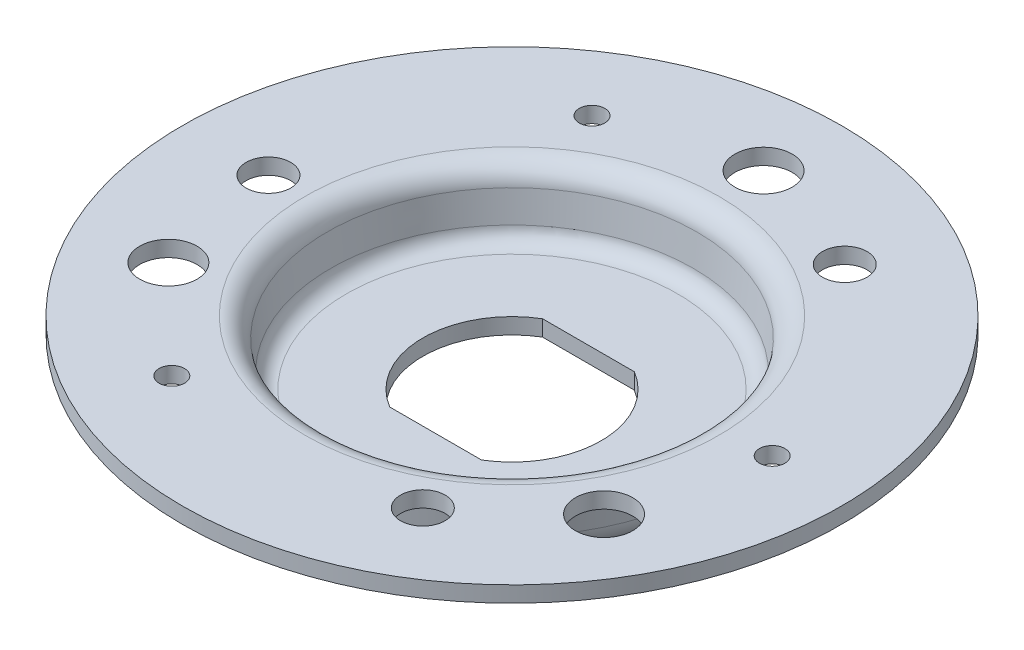
ISO-10303-21;
HEADER;
FILE_DESCRIPTION(('STEP AP214'),'2;1');
FILE_NAME('part.step','',(''),(''),'','','');
FILE_SCHEMA(('AUTOMOTIVE_DESIGN { 1 0 10303 214 1 1 1 1 }'));
ENDSEC;
DATA;
#1=APPLICATION_CONTEXT('core data for automotive mechanical design processes');
#2=APPLICATION_PROTOCOL_DEFINITION('international standard','automotive_design',2000,#1);
#3=PRODUCT_CONTEXT('',#1,'mechanical');
#4=PRODUCT('Part','Part','',(#3));
#5=PRODUCT_RELATED_PRODUCT_CATEGORY('part','',(#4));
#6=PRODUCT_DEFINITION_FORMATION('','',#4);
#7=PRODUCT_DEFINITION_CONTEXT('part definition',#1,'design');
#8=PRODUCT_DEFINITION('design','',#6,#7);
#9=PRODUCT_DEFINITION_SHAPE('','',#8);
#10=(LENGTH_UNIT() NAMED_UNIT(*) SI_UNIT(.MILLI.,.METRE.));
#11=(NAMED_UNIT(*) PLANE_ANGLE_UNIT() SI_UNIT($,.RADIAN.));
#12=(NAMED_UNIT(*) SI_UNIT($,.STERADIAN.) SOLID_ANGLE_UNIT());
#13=UNCERTAINTY_MEASURE_WITH_UNIT(LENGTH_MEASURE(1.E-05),#10,'distance_accuracy_value','');
#14=(GEOMETRIC_REPRESENTATION_CONTEXT(3) GLOBAL_UNCERTAINTY_ASSIGNED_CONTEXT((#13)) GLOBAL_UNIT_ASSIGNED_CONTEXT((#10,
#11,#12)) REPRESENTATION_CONTEXT('',''));
#15=CARTESIAN_POINT('',(0.,0.,0.));
#16=DIRECTION('',(0.,0.,1.));
#17=DIRECTION('',(1.,0.,0.));
#18=AXIS2_PLACEMENT_3D('',#15,#16,#17);
#19=CARTESIAN_POINT('',(0.,0.,12.));
#20=DIRECTION('',(0.,-1.,0.));
#21=DIRECTION('',(0.,0.,-1.));
#22=AXIS2_PLACEMENT_3D('',#19,#20,#21);
#23=PLANE('',#22);
#24=CARTESIAN_POINT('',(0.,0.,0.));
#25=DIRECTION('',(0.,1.,0.));
#26=DIRECTION('',(0.,0.,1.));
#27=AXIS2_PLACEMENT_3D('',#24,#25,#26);
#28=CIRCLE('',#27,14.);
#29=CARTESIAN_POINT('',(-7.21110255092797,0.,-12.));
#30=VERTEX_POINT('',#29);
#31=CARTESIAN_POINT('',(-7.21110255092797,0.,12.));
#32=VERTEX_POINT('',#31);
#33=EDGE_CURVE('E84',#30,#32,#28,.T.);
#34=ORIENTED_EDGE('',*,*,#33,.T.);
#35=DIRECTION('',(1.,0.,0.));
#36=VECTOR('',#35,1.);
#37=CARTESIAN_POINT('',(-7.21110255092797,0.,12.));
#38=LINE('',#37,#36);
#39=CARTESIAN_POINT('',(7.21110255092797,0.,12.));
#40=VERTEX_POINT('',#39);
#41=EDGE_CURVE('E91',#32,#40,#38,.T.);
#42=ORIENTED_EDGE('',*,*,#41,.T.);
#43=CARTESIAN_POINT('',(0.,0.,0.));
#44=DIRECTION('',(0.,1.,0.));
#45=DIRECTION('',(0.,0.,1.));
#46=AXIS2_PLACEMENT_3D('',#43,#44,#45);
#47=CIRCLE('',#46,14.);
#48=CARTESIAN_POINT('',(7.21110255092797,0.,-12.));
#49=VERTEX_POINT('',#48);
#50=EDGE_CURVE('E96',#40,#49,#47,.T.);
#51=ORIENTED_EDGE('',*,*,#50,.T.);
#52=DIRECTION('',(-1.,0.,0.));
#53=VECTOR('',#52,1.);
#54=CARTESIAN_POINT('',(-7.21110255092797,0.,-12.));
#55=LINE('',#54,#53);
#56=EDGE_CURVE('E88',#49,#30,#55,.T.);
#57=ORIENTED_EDGE('',*,*,#56,.T.);
#58=EDGE_LOOP('',(#34,#42,#51,#57));
#59=FACE_BOUND('',#58,.T.);
#60=CARTESIAN_POINT('',(0.,0.,0.));
#61=DIRECTION('',(0.,1.,0.));
#62=DIRECTION('',(0.,0.,1.));
#63=AXIS2_PLACEMENT_3D('',#60,#61,#62);
#64=CIRCLE('',#63,26.);
#65=CARTESIAN_POINT('',(0.,0.,26.));
#66=VERTEX_POINT('',#65);
#67=EDGE_CURVE('E170',#66,#66,#64,.T.);
#68=ORIENTED_EDGE('',*,*,#67,.F.);
#69=EDGE_LOOP('',(#68));
#70=FACE_BOUND('',#69,.T.);
#71=ADVANCED_FACE('F39',(#59,#70),#23,.T.);
#72=CARTESIAN_POINT('',(0.,5.,0.));
#73=DIRECTION('',(0.,1.,0.));
#74=DIRECTION('',(0.,0.,1.));
#75=AXIS2_PLACEMENT_3D('',#72,#73,#74);
#76=TOROIDAL_SURFACE('',#75,26.,5.);
#77=ORIENTED_EDGE('',*,*,#67,.T.);
#78=EDGE_LOOP('',(#77));
#79=FACE_BOUND('',#78,.T.);
#80=CARTESIAN_POINT('',(0.,4.42828852539193,0.));
#81=DIRECTION('',(0.,1.,0.));
#82=DIRECTION('',(0.,0.,1.));
#83=AXIS2_PLACEMENT_3D('',#80,#81,#82);
#84=CIRCLE('',#83,30.9672070612973);
#85=CARTESIAN_POINT('',(0.,4.42828852539193,30.9672070612973));
#86=VERTEX_POINT('',#85);
#87=EDGE_CURVE('E167',#86,#86,#84,.T.);
#88=ORIENTED_EDGE('',*,*,#87,.F.);
#89=EDGE_LOOP('',(#88));
#90=FACE_BOUND('',#89,.T.);
#91=ADVANCED_FACE('F196',(#79,#90),#76,.T.);
#92=CARTESIAN_POINT('',(0.,9.11434229492161,0.));
#93=DIRECTION('',(0.,1.,0.));
#94=DIRECTION('',(0.,0.,1.));
#95=AXIS2_PLACEMENT_3D('',#92,#93,#94);
#96=CONICAL_SURFACE('',#95,31.5065585877405,0.114592927220508);
#97=ORIENTED_EDGE('',*,*,#87,.T.);
#98=EDGE_LOOP('',(#97));
#99=FACE_BOUND('',#98,.T.);
#100=CARTESIAN_POINT('',(0.,9.11434229492161,0.));
#101=DIRECTION('',(0.,1.,0.));
#102=DIRECTION('',(0.,0.,1.));
#103=AXIS2_PLACEMENT_3D('',#100,#101,#102);
#104=CIRCLE('',#103,31.5065585877405);
#105=CARTESIAN_POINT('',(0.,9.11434229492161,31.5065585877405));
#106=VERTEX_POINT('',#105);
#107=EDGE_CURVE('E164',#106,#106,#104,.T.);
#108=ORIENTED_EDGE('',*,*,#107,.F.);
#109=EDGE_LOOP('',(#108));
#110=FACE_BOUND('',#109,.T.);
#111=ADVANCED_FACE('F201',(#99,#110),#96,.T.);
#112=CARTESIAN_POINT('',(0.,9.,0.));
#113=DIRECTION('',(0.,1.,0.));
#114=DIRECTION('',(0.,0.,1.));
#115=AXIS2_PLACEMENT_3D('',#112,#113,#114);
#116=TOROIDAL_SURFACE('',#115,32.5,1.);
#117=ORIENTED_EDGE('',*,*,#107,.T.);
#118=EDGE_LOOP('',(#117));
#119=FACE_BOUND('',#118,.T.);
#120=CARTESIAN_POINT('',(0.,10.,0.));
#121=DIRECTION('',(0.,1.,0.));
#122=DIRECTION('',(0.,0.,1.));
#123=AXIS2_PLACEMENT_3D('',#120,#121,#122);
#124=CIRCLE('',#123,32.5);
#125=CARTESIAN_POINT('',(0.,10.,32.5));
#126=VERTEX_POINT('',#125);
#127=EDGE_CURVE('E161',#126,#126,#124,.T.);
#128=ORIENTED_EDGE('',*,*,#127,.F.);
#129=EDGE_LOOP('',(#128));
#130=FACE_BOUND('',#129,.T.);
#131=ADVANCED_FACE('F206',(#119,#130),#116,.F.);
#132=CARTESIAN_POINT('',(0.,10.,32.5));
#133=DIRECTION('',(0.,-1.,0.));
#134=DIRECTION('',(0.,0.,-1.));
#135=AXIS2_PLACEMENT_3D('',#132,#133,#134);
#136=PLANE('',#135);
#137=CARTESIAN_POINT('',(-18.5441267300429,10.,34.8764299179275));
#138=DIRECTION('',(0.,-1.,0.));
#139=DIRECTION('',(0.,0.,-1.));
#140=AXIS2_PLACEMENT_3D('',#137,#138,#139);
#141=CIRCLE('',#140,2.00000000000001);
#142=CARTESIAN_POINT('',(-18.5441267300429,10.,32.8764299179275));
#143=VERTEX_POINT('',#142);
#144=EDGE_CURVE('E140',#143,#143,#141,.T.);
#145=ORIENTED_EDGE('',*,*,#144,.F.);
#146=EDGE_LOOP('',(#145));
#147=FACE_BOUND('',#146,.T.);
#148=CARTESIAN_POINT('',(-34.2080034494853,10.,19.75));
#149=DIRECTION('',(0.,-1.,0.));
#150=DIRECTION('',(0.,0.,-1.));
#151=AXIS2_PLACEMENT_3D('',#148,#149,#150);
#152=CIRCLE('',#151,4.5);
#153=CARTESIAN_POINT('',(-34.2080034494853,10.,15.25));
#154=VERTEX_POINT('',#153);
#155=EDGE_CURVE('E137',#154,#154,#152,.T.);
#156=ORIENTED_EDGE('',*,*,#155,.F.);
#157=EDGE_LOOP('',(#156));
#158=FACE_BOUND('',#157,.T.);
#159=CARTESIAN_POINT('',(19.1250000000002,10.,33.1254716947546));
#160=DIRECTION('',(0.,-1.,0.));
#161=DIRECTION('',(0.,0.,-1.));
#162=AXIS2_PLACEMENT_3D('',#159,#160,#161);
#163=CIRCLE('',#162,3.5);
#164=CARTESIAN_POINT('',(19.1250000000002,10.,29.6254716947546));
#165=VERTEX_POINT('',#164);
#166=EDGE_CURVE('E134',#165,#165,#163,.T.);
#167=ORIENTED_EDGE('',*,*,#166,.F.);
#168=EDGE_LOOP('',(#167));
#169=FACE_BOUND('',#168,.T.);
#170=CARTESIAN_POINT('',(39.4759376672543,10.,-1.37853011974858));
#171=DIRECTION('',(0.,-1.,0.));
#172=DIRECTION('',(0.,0.,-1.));
#173=AXIS2_PLACEMENT_3D('',#170,#171,#172);
#174=CIRCLE('',#173,2.);
#175=CARTESIAN_POINT('',(39.4759376672543,10.,-3.37853011974857));
#176=VERTEX_POINT('',#175);
#177=EDGE_CURVE('E131',#176,#176,#174,.T.);
#178=ORIENTED_EDGE('',*,*,#177,.F.);
#179=EDGE_LOOP('',(#178));
#180=FACE_BOUND('',#179,.T.);
#181=CARTESIAN_POINT('',(34.2080034494853,10.,19.75));
#182=DIRECTION('',(0.,-1.,0.));
#183=DIRECTION('',(0.,0.,-1.));
#184=AXIS2_PLACEMENT_3D('',#181,#182,#183);
#185=CIRCLE('',#184,4.5);
#186=CARTESIAN_POINT('',(34.2080034494853,10.,15.25));
#187=VERTEX_POINT('',#186);
#188=EDGE_CURVE('E128',#187,#187,#185,.T.);
#189=ORIENTED_EDGE('',*,*,#188,.F.);
#190=EDGE_LOOP('',(#189));
#191=FACE_BOUND('',#190,.T.);
#192=CARTESIAN_POINT('',(19.1249999999998,10.,-33.1254716947549));
#193=DIRECTION('',(0.,-1.,0.));
#194=DIRECTION('',(0.,0.,-1.));
#195=AXIS2_PLACEMENT_3D('',#192,#193,#194);
#196=CIRCLE('',#195,3.5);
#197=CARTESIAN_POINT('',(19.1249999999998,10.,-36.6254716947549));
#198=VERTEX_POINT('',#197);
#199=EDGE_CURVE('E125',#198,#198,#196,.T.);
#200=ORIENTED_EDGE('',*,*,#199,.F.);
#201=EDGE_LOOP('',(#200));
#202=FACE_BOUND('',#201,.T.);
#203=CARTESIAN_POINT('',(-20.9318109372114,10.,-33.4978997981789));
#204=DIRECTION('',(0.,-1.,0.));
#205=DIRECTION('',(0.,0.,-1.));
#206=AXIS2_PLACEMENT_3D('',#203,#204,#205);
#207=CIRCLE('',#206,2.00000000000001);
#208=CARTESIAN_POINT('',(-20.9318109372114,10.,-35.497899798179));
#209=VERTEX_POINT('',#208);
#210=EDGE_CURVE('E122',#209,#209,#207,.T.);
#211=ORIENTED_EDGE('',*,*,#210,.F.);
#212=EDGE_LOOP('',(#211));
#213=FACE_BOUND('',#212,.T.);
#214=CARTESIAN_POINT('',(0.,10.,-39.5));
#215=DIRECTION('',(0.,-1.,0.));
#216=DIRECTION('',(0.,0.,-1.));
#217=AXIS2_PLACEMENT_3D('',#214,#215,#216);
#218=CIRCLE('',#217,4.5);
#219=CARTESIAN_POINT('',(0.,10.,-44.));
#220=VERTEX_POINT('',#219);
#221=EDGE_CURVE('E119',#220,#220,#218,.T.);
#222=ORIENTED_EDGE('',*,*,#221,.F.);
#223=EDGE_LOOP('',(#222));
#224=FACE_BOUND('',#223,.T.);
#225=CARTESIAN_POINT('',(-38.25,10.,2.56739074444567E-13));
#226=DIRECTION('',(0.,-1.,0.));
#227=DIRECTION('',(0.,0.,-1.));
#228=AXIS2_PLACEMENT_3D('',#225,#226,#227);
#229=CIRCLE('',#228,3.5);
#230=CARTESIAN_POINT('',(-38.25,10.,-3.49999999999974));
#231=VERTEX_POINT('',#230);
#232=EDGE_CURVE('E113',#231,#231,#229,.T.);
#233=ORIENTED_EDGE('',*,*,#232,.F.);
#234=EDGE_LOOP('',(#233));
#235=FACE_BOUND('',#234,.T.);
#236=ORIENTED_EDGE('',*,*,#127,.T.);
#237=EDGE_LOOP('',(#236));
#238=FACE_BOUND('',#237,.T.);
#239=CARTESIAN_POINT('',(0.,9.99999999999999,0.));
#240=DIRECTION('',(0.,1.,0.));
#241=DIRECTION('',(0.,0.,1.));
#242=AXIS2_PLACEMENT_3D('',#239,#240,#241);
#243=CIRCLE('',#242,51.75);
#244=CARTESIAN_POINT('',(0.,9.99999999999999,51.75));
#245=VERTEX_POINT('',#244);
#246=EDGE_CURVE('E158',#245,#245,#243,.T.);
#247=ORIENTED_EDGE('',*,*,#246,.F.);
#248=EDGE_LOOP('',(#247));
#249=FACE_BOUND('',#248,.T.);
#250=ADVANCED_FACE('F213',(#147,#158,#169,#180,#191,#202,#213,#224,#235,#238,#249),#136,.T.);
#251=CARTESIAN_POINT('',(0.,0.,0.));
#252=DIRECTION('',(0.,1.,0.));
#253=DIRECTION('',(0.,0.,1.));
#254=AXIS2_PLACEMENT_3D('',#251,#252,#253);
#255=CYLINDRICAL_SURFACE('',#254,51.75);
#256=ORIENTED_EDGE('',*,*,#246,.T.);
#257=EDGE_LOOP('',(#256));
#258=FACE_BOUND('',#257,.T.);
#259=CARTESIAN_POINT('',(0.,12.5,0.));
#260=DIRECTION('',(0.,1.,0.));
#261=DIRECTION('',(0.,0.,1.));
#262=AXIS2_PLACEMENT_3D('',#259,#260,#261);
#263=CIRCLE('',#262,51.75);
#264=CARTESIAN_POINT('',(0.,12.5,51.75));
#265=VERTEX_POINT('',#264);
#266=EDGE_CURVE('E155',#265,#265,#263,.T.);
#267=ORIENTED_EDGE('',*,*,#266,.F.);
#268=EDGE_LOOP('',(#267));
#269=FACE_BOUND('',#268,.T.);
#270=ADVANCED_FACE('F216',(#258,#269),#255,.T.);
#271=CARTESIAN_POINT('',(0.,12.5,32.5));
#272=DIRECTION('',(0.,1.,0.));
#273=DIRECTION('',(0.,0.,1.));
#274=AXIS2_PLACEMENT_3D('',#271,#272,#273);
#275=PLANE('',#274);
#276=CARTESIAN_POINT('',(-18.5441267300429,12.5,34.8764299179275));
#277=DIRECTION('',(0.,1.,0.));
#278=DIRECTION('',(0.,0.,1.));
#279=AXIS2_PLACEMENT_3D('',#276,#277,#278);
#280=CIRCLE('',#279,2.00000000000001);
#281=CARTESIAN_POINT('',(-18.5441267300429,12.5,36.8764299179275));
#282=VERTEX_POINT('',#281);
#283=EDGE_CURVE('E350',#282,#282,#280,.T.);
#284=ORIENTED_EDGE('',*,*,#283,.F.);
#285=EDGE_LOOP('',(#284));
#286=FACE_BOUND('',#285,.T.);
#287=CARTESIAN_POINT('',(-34.2080034494853,12.5,19.75));
#288=DIRECTION('',(0.,1.,0.));
#289=DIRECTION('',(0.,0.,1.));
#290=AXIS2_PLACEMENT_3D('',#287,#288,#289);
#291=CIRCLE('',#290,4.5);
#292=CARTESIAN_POINT('',(-34.2080034494853,12.5,24.25));
#293=VERTEX_POINT('',#292);
#294=EDGE_CURVE('E351',#293,#293,#291,.T.);
#295=ORIENTED_EDGE('',*,*,#294,.F.);
#296=EDGE_LOOP('',(#295));
#297=FACE_BOUND('',#296,.T.);
#298=CARTESIAN_POINT('',(19.1250000000002,12.5,33.1254716947546));
#299=DIRECTION('',(0.,1.,0.));
#300=DIRECTION('',(0.,0.,1.));
#301=AXIS2_PLACEMENT_3D('',#298,#299,#300);
#302=CIRCLE('',#301,3.5);
#303=CARTESIAN_POINT('',(19.1250000000002,12.5,36.6254716947547));
#304=VERTEX_POINT('',#303);
#305=EDGE_CURVE('E355',#304,#304,#302,.T.);
#306=ORIENTED_EDGE('',*,*,#305,.F.);
#307=EDGE_LOOP('',(#306));
#308=FACE_BOUND('',#307,.T.);
#309=CARTESIAN_POINT('',(39.4759376672543,12.5,-1.37853011974858));
#310=DIRECTION('',(0.,1.,0.));
#311=DIRECTION('',(0.,0.,1.));
#312=AXIS2_PLACEMENT_3D('',#309,#310,#311);
#313=CIRCLE('',#312,2.);
#314=CARTESIAN_POINT('',(39.4759376672543,12.5,0.621469880251421));
#315=VERTEX_POINT('',#314);
#316=EDGE_CURVE('E367',#315,#315,#313,.T.);
#317=ORIENTED_EDGE('',*,*,#316,.F.);
#318=EDGE_LOOP('',(#317));
#319=FACE_BOUND('',#318,.T.);
#320=CARTESIAN_POINT('',(34.2080034494853,12.5,19.75));
#321=DIRECTION('',(0.,1.,0.));
#322=DIRECTION('',(0.,0.,1.));
#323=AXIS2_PLACEMENT_3D('',#320,#321,#322);
#324=CIRCLE('',#323,4.5);
#325=CARTESIAN_POINT('',(34.2080034494853,12.5,24.25));
#326=VERTEX_POINT('',#325);
#327=EDGE_CURVE('E106',#326,#326,#324,.T.);
#328=ORIENTED_EDGE('',*,*,#327,.F.);
#329=EDGE_LOOP('',(#328));
#330=FACE_BOUND('',#329,.T.);
#331=CARTESIAN_POINT('',(19.1249999999998,12.5,-33.1254716947549));
#332=DIRECTION('',(0.,1.,0.));
#333=DIRECTION('',(0.,0.,1.));
#334=AXIS2_PLACEMENT_3D('',#331,#332,#333);
#335=CIRCLE('',#334,3.5);
#336=CARTESIAN_POINT('',(19.1249999999998,12.5,-29.6254716947549));
#337=VERTEX_POINT('',#336);
#338=EDGE_CURVE('E362',#337,#337,#335,.T.);
#339=ORIENTED_EDGE('',*,*,#338,.F.);
#340=EDGE_LOOP('',(#339));
#341=FACE_BOUND('',#340,.T.);
#342=CARTESIAN_POINT('',(-20.9318109372114,12.5,-33.4978997981789));
#343=DIRECTION('',(0.,1.,0.));
#344=DIRECTION('',(0.,0.,1.));
#345=AXIS2_PLACEMENT_3D('',#342,#343,#344);
#346=CIRCLE('',#345,2.00000000000001);
#347=CARTESIAN_POINT('',(-20.9318109372114,12.5,-31.4978997981789));
#348=VERTEX_POINT('',#347);
#349=EDGE_CURVE('E103',#348,#348,#346,.T.);
#350=ORIENTED_EDGE('',*,*,#349,.F.);
#351=EDGE_LOOP('',(#350));
#352=FACE_BOUND('',#351,.T.);
#353=CARTESIAN_POINT('',(0.,12.5,-39.5));
#354=DIRECTION('',(0.,1.,0.));
#355=DIRECTION('',(0.,0.,1.));
#356=AXIS2_PLACEMENT_3D('',#353,#354,#355);
#357=CIRCLE('',#356,4.5);
#358=CARTESIAN_POINT('',(0.,12.5,-35.));
#359=VERTEX_POINT('',#358);
#360=EDGE_CURVE('E100',#359,#359,#357,.T.);
#361=ORIENTED_EDGE('',*,*,#360,.F.);
#362=EDGE_LOOP('',(#361));
#363=FACE_BOUND('',#362,.T.);
#364=CARTESIAN_POINT('',(-38.25,12.5,2.56739074444567E-13));
#365=DIRECTION('',(0.,1.,0.));
#366=DIRECTION('',(0.,0.,1.));
#367=AXIS2_PLACEMENT_3D('',#364,#365,#366);
#368=CIRCLE('',#367,3.5);
#369=CARTESIAN_POINT('',(-38.25,12.5,3.50000000000026));
#370=VERTEX_POINT('',#369);
#371=EDGE_CURVE('E352',#370,#370,#368,.T.);
#372=ORIENTED_EDGE('',*,*,#371,.F.);
#373=EDGE_LOOP('',(#372));
#374=FACE_BOUND('',#373,.T.);
#375=ORIENTED_EDGE('',*,*,#266,.T.);
#376=EDGE_LOOP('',(#375));
#377=FACE_BOUND('',#376,.T.);
#378=CARTESIAN_POINT('',(0.,12.5,0.));
#379=DIRECTION('',(0.,1.,0.));
#380=DIRECTION('',(0.,0.,1.));
#381=AXIS2_PLACEMENT_3D('',#378,#379,#380);
#382=CIRCLE('',#381,32.5);
#383=CARTESIAN_POINT('',(0.,12.5,32.5));
#384=VERTEX_POINT('',#383);
#385=EDGE_CURVE('E152',#384,#384,#382,.T.);
#386=ORIENTED_EDGE('',*,*,#385,.F.);
#387=EDGE_LOOP('',(#386));
#388=FACE_BOUND('',#387,.T.);
#389=ADVANCED_FACE('F220',(#286,#297,#308,#319,#330,#341,#352,#363,#374,#377,#388),#275,.T.);
#390=CARTESIAN_POINT('',(0.,9.,0.));
#391=DIRECTION('',(0.,1.,0.));
#392=DIRECTION('',(0.,0.,1.));
#393=AXIS2_PLACEMENT_3D('',#390,#391,#392);
#394=TOROIDAL_SURFACE('',#393,32.5,3.5);
#395=ORIENTED_EDGE('',*,*,#385,.T.);
#396=EDGE_LOOP('',(#395));
#397=FACE_BOUND('',#396,.T.);
#398=CARTESIAN_POINT('',(0.,9.40019803222565,0.));
#399=DIRECTION('',(0.,1.,0.));
#400=DIRECTION('',(0.,0.,1.));
#401=AXIS2_PLACEMENT_3D('',#398,#399,#400);
#402=CIRCLE('',#401,29.0229550570919);
#403=CARTESIAN_POINT('',(0.,9.40019803222565,29.0229550570919));
#404=VERTEX_POINT('',#403);
#405=EDGE_CURVE('E149',#404,#404,#402,.T.);
#406=ORIENTED_EDGE('',*,*,#405,.F.);
#407=EDGE_LOOP('',(#406));
#408=FACE_BOUND('',#407,.T.);
#409=ADVANCED_FACE('F193',(#397,#408),#394,.T.);
#410=CARTESIAN_POINT('',(0.,4.71414426269596,0.));
#411=DIRECTION('',(0.,1.,0.));
#412=DIRECTION('',(0.,0.,1.));
#413=AXIS2_PLACEMENT_3D('',#410,#411,#412);
#414=CONICAL_SURFACE('',#413,28.4836035306486,0.114592927220509);
#415=ORIENTED_EDGE('',*,*,#405,.T.);
#416=EDGE_LOOP('',(#415));
#417=FACE_BOUND('',#416,.T.);
#418=CARTESIAN_POINT('',(0.,4.71414426269596,0.));
#419=DIRECTION('',(0.,1.,0.));
#420=DIRECTION('',(0.,0.,1.));
#421=AXIS2_PLACEMENT_3D('',#418,#419,#420);
#422=CIRCLE('',#421,28.4836035306486);
#423=CARTESIAN_POINT('',(0.,4.71414426269596,28.4836035306486));
#424=VERTEX_POINT('',#423);
#425=EDGE_CURVE('E146',#424,#424,#422,.T.);
#426=ORIENTED_EDGE('',*,*,#425,.F.);
#427=EDGE_LOOP('',(#426));
#428=FACE_BOUND('',#427,.T.);
#429=ADVANCED_FACE('F186',(#417,#428),#414,.F.);
#430=CARTESIAN_POINT('',(0.,5.,0.));
#431=DIRECTION('',(0.,1.,0.));
#432=DIRECTION('',(0.,0.,1.));
#433=AXIS2_PLACEMENT_3D('',#430,#431,#432);
#434=TOROIDAL_SURFACE('',#433,26.,2.5);
#435=ORIENTED_EDGE('',*,*,#425,.T.);
#436=EDGE_LOOP('',(#435));
#437=FACE_BOUND('',#436,.T.);
#438=CARTESIAN_POINT('',(0.,2.5,0.));
#439=DIRECTION('',(0.,1.,0.));
#440=DIRECTION('',(0.,0.,1.));
#441=AXIS2_PLACEMENT_3D('',#438,#439,#440);
#442=CIRCLE('',#441,26.);
#443=CARTESIAN_POINT('',(0.,2.5,26.));
#444=VERTEX_POINT('',#443);
#445=EDGE_CURVE('E143',#444,#444,#442,.T.);
#446=ORIENTED_EDGE('',*,*,#445,.F.);
#447=EDGE_LOOP('',(#446));
#448=FACE_BOUND('',#447,.T.);
#449=ADVANCED_FACE('F181',(#437,#448),#434,.F.);
#450=CARTESIAN_POINT('',(0.,2.5,12.));
#451=DIRECTION('',(0.,1.,0.));
#452=DIRECTION('',(0.,0.,1.));
#453=AXIS2_PLACEMENT_3D('',#450,#451,#452);
#454=PLANE('',#453);
#455=CARTESIAN_POINT('',(0.,2.5,0.));
#456=DIRECTION('',(0.,1.,0.));
#457=DIRECTION('',(0.,0.,1.));
#458=AXIS2_PLACEMENT_3D('',#455,#456,#457);
#459=CIRCLE('',#458,14.);
#460=CARTESIAN_POINT('',(-7.21110255092797,2.5,-12.));
#461=VERTEX_POINT('',#460);
#462=CARTESIAN_POINT('',(-7.21110255092797,2.5,12.));
#463=VERTEX_POINT('',#462);
#464=EDGE_CURVE('E11',#461,#463,#459,.T.);
#465=ORIENTED_EDGE('',*,*,#464,.F.);
#466=DIRECTION('',(-1.,0.,0.));
#467=VECTOR('',#466,1.);
#468=CARTESIAN_POINT('',(0.,2.5,-12.));
#469=LINE('',#468,#467);
#470=CARTESIAN_POINT('',(7.21110255092797,2.5,-12.));
#471=VERTEX_POINT('',#470);
#472=EDGE_CURVE('E46',#471,#461,#469,.T.);
#473=ORIENTED_EDGE('',*,*,#472,.F.);
#474=CARTESIAN_POINT('',(0.,2.5,0.));
#475=DIRECTION('',(0.,1.,0.));
#476=DIRECTION('',(0.,0.,1.));
#477=AXIS2_PLACEMENT_3D('',#474,#475,#476);
#478=CIRCLE('',#477,14.);
#479=CARTESIAN_POINT('',(7.21110255092797,2.5,12.));
#480=VERTEX_POINT('',#479);
#481=EDGE_CURVE('E60',#480,#471,#478,.T.);
#482=ORIENTED_EDGE('',*,*,#481,.F.);
#483=DIRECTION('',(1.,0.,0.));
#484=VECTOR('',#483,1.);
#485=CARTESIAN_POINT('',(0.,2.5,12.));
#486=LINE('',#485,#484);
#487=EDGE_CURVE('E173',#463,#480,#486,.T.);
#488=ORIENTED_EDGE('',*,*,#487,.F.);
#489=EDGE_LOOP('',(#465,#473,#482,#488));
#490=FACE_BOUND('',#489,.T.);
#491=ORIENTED_EDGE('',*,*,#445,.T.);
#492=EDGE_LOOP('',(#491));
#493=FACE_BOUND('',#492,.T.);
#494=ADVANCED_FACE('F177',(#490,#493),#454,.T.);
#495=CARTESIAN_POINT('',(-7.21110255092797,0.,-12.));
#496=DIRECTION('',(0.,0.,-1.));
#497=DIRECTION('',(-1.,0.,0.));
#498=AXIS2_PLACEMENT_3D('',#495,#496,#497);
#499=PLANE('',#498);
#500=ORIENTED_EDGE('',*,*,#56,.F.);
#501=DIRECTION('',(0.,1.,0.));
#502=VECTOR('',#501,1.);
#503=CARTESIAN_POINT('',(7.21110255092797,0.,-12.));
#504=LINE('',#503,#502);
#505=EDGE_CURVE('E114',#49,#471,#504,.T.);
#506=ORIENTED_EDGE('',*,*,#505,.T.);
#507=ORIENTED_EDGE('',*,*,#472,.T.);
#508=DIRECTION('',(0.,1.,0.));
#509=VECTOR('',#508,1.);
#510=CARTESIAN_POINT('',(-7.21110255092797,0.,-12.));
#511=LINE('',#510,#509);
#512=EDGE_CURVE('E111',#30,#461,#511,.T.);
#513=ORIENTED_EDGE('',*,*,#512,.F.);
#514=EDGE_LOOP('',(#500,#506,#507,#513));
#515=FACE_BOUND('',#514,.T.);
#516=ADVANCED_FACE('F180',(#515),#499,.F.);
#517=CARTESIAN_POINT('',(-7.21110255092797,0.,12.));
#518=DIRECTION('',(0.,0.,1.));
#519=DIRECTION('',(1.,0.,0.));
#520=AXIS2_PLACEMENT_3D('',#517,#518,#519);
#521=PLANE('',#520);
#522=ORIENTED_EDGE('',*,*,#41,.F.);
#523=DIRECTION('',(0.,1.,0.));
#524=VECTOR('',#523,1.);
#525=CARTESIAN_POINT('',(-7.21110255092797,0.,12.));
#526=LINE('',#525,#524);
#527=EDGE_CURVE('E80',#32,#463,#526,.T.);
#528=ORIENTED_EDGE('',*,*,#527,.T.);
#529=ORIENTED_EDGE('',*,*,#487,.T.);
#530=DIRECTION('',(0.,1.,0.));
#531=VECTOR('',#530,1.);
#532=CARTESIAN_POINT('',(7.21110255092797,0.,12.));
#533=LINE('',#532,#531);
#534=EDGE_CURVE('E87',#40,#480,#533,.T.);
#535=ORIENTED_EDGE('',*,*,#534,.F.);
#536=EDGE_LOOP('',(#522,#528,#529,#535));
#537=FACE_BOUND('',#536,.T.);
#538=ADVANCED_FACE('F92',(#537),#521,.F.);
#539=CARTESIAN_POINT('',(0.,0.,0.));
#540=DIRECTION('',(0.,1.,0.));
#541=DIRECTION('',(0.,0.,1.));
#542=AXIS2_PLACEMENT_3D('',#539,#540,#541);
#543=CYLINDRICAL_SURFACE('',#542,14.);
#544=ORIENTED_EDGE('',*,*,#464,.T.);
#545=ORIENTED_EDGE('',*,*,#527,.F.);
#546=ORIENTED_EDGE('',*,*,#33,.F.);
#547=ORIENTED_EDGE('',*,*,#512,.T.);
#548=EDGE_LOOP('',(#544,#545,#546,#547));
#549=FACE_BOUND('',#548,.T.);
#550=ADVANCED_FACE('F82',(#549),#543,.F.);
#551=CARTESIAN_POINT('',(0.,0.,0.));
#552=DIRECTION('',(0.,1.,0.));
#553=DIRECTION('',(0.,0.,1.));
#554=AXIS2_PLACEMENT_3D('',#551,#552,#553);
#555=CYLINDRICAL_SURFACE('',#554,14.);
#556=ORIENTED_EDGE('',*,*,#481,.T.);
#557=ORIENTED_EDGE('',*,*,#505,.F.);
#558=ORIENTED_EDGE('',*,*,#50,.F.);
#559=ORIENTED_EDGE('',*,*,#534,.T.);
#560=EDGE_LOOP('',(#556,#557,#558,#559));
#561=FACE_BOUND('',#560,.T.);
#562=ADVANCED_FACE('F176',(#561),#555,.F.);
#563=CARTESIAN_POINT('',(-38.25,0.,2.56739074444567E-13));
#564=DIRECTION('',(0.,1.,0.));
#565=DIRECTION('',(0.,0.,1.));
#566=AXIS2_PLACEMENT_3D('',#563,#564,#565);
#567=CYLINDRICAL_SURFACE('',#566,3.5);
#568=ORIENTED_EDGE('',*,*,#232,.T.);
#569=EDGE_LOOP('',(#568));
#570=FACE_BOUND('',#569,.T.);
#571=ORIENTED_EDGE('',*,*,#371,.T.);
#572=EDGE_LOOP('',(#571));
#573=FACE_BOUND('',#572,.T.);
#574=ADVANCED_FACE('F273',(#570,#573),#567,.F.);
#575=CARTESIAN_POINT('',(0.,0.,-39.5));
#576=DIRECTION('',(0.,1.,0.));
#577=DIRECTION('',(0.,0.,1.));
#578=AXIS2_PLACEMENT_3D('',#575,#576,#577);
#579=CYLINDRICAL_SURFACE('',#578,4.5);
#580=ORIENTED_EDGE('',*,*,#221,.T.);
#581=EDGE_LOOP('',(#580));
#582=FACE_BOUND('',#581,.T.);
#583=ORIENTED_EDGE('',*,*,#360,.T.);
#584=EDGE_LOOP('',(#583));
#585=FACE_BOUND('',#584,.T.);
#586=ADVANCED_FACE('F280',(#582,#585),#579,.F.);
#587=CARTESIAN_POINT('',(-20.9318109372114,0.,-33.4978997981789));
#588=DIRECTION('',(0.,1.,0.));
#589=DIRECTION('',(0.,0.,1.));
#590=AXIS2_PLACEMENT_3D('',#587,#588,#589);
#591=CYLINDRICAL_SURFACE('',#590,2.00000000000001);
#592=ORIENTED_EDGE('',*,*,#210,.T.);
#593=EDGE_LOOP('',(#592));
#594=FACE_BOUND('',#593,.T.);
#595=ORIENTED_EDGE('',*,*,#349,.T.);
#596=EDGE_LOOP('',(#595));
#597=FACE_BOUND('',#596,.T.);
#598=ADVANCED_FACE('F288',(#594,#597),#591,.F.);
#599=CARTESIAN_POINT('',(19.1249999999998,0.,-33.1254716947549));
#600=DIRECTION('',(0.,1.,0.));
#601=DIRECTION('',(0.,0.,1.));
#602=AXIS2_PLACEMENT_3D('',#599,#600,#601);
#603=CYLINDRICAL_SURFACE('',#602,3.5);
#604=ORIENTED_EDGE('',*,*,#199,.T.);
#605=EDGE_LOOP('',(#604));
#606=FACE_BOUND('',#605,.T.);
#607=ORIENTED_EDGE('',*,*,#338,.T.);
#608=EDGE_LOOP('',(#607));
#609=FACE_BOUND('',#608,.T.);
#610=ADVANCED_FACE('F296',(#606,#609),#603,.F.);
#611=CARTESIAN_POINT('',(34.2080034494853,0.,19.75));
#612=DIRECTION('',(0.,1.,0.));
#613=DIRECTION('',(0.,0.,1.));
#614=AXIS2_PLACEMENT_3D('',#611,#612,#613);
#615=CYLINDRICAL_SURFACE('',#614,4.5);
#616=ORIENTED_EDGE('',*,*,#188,.T.);
#617=EDGE_LOOP('',(#616));
#618=FACE_BOUND('',#617,.T.);
#619=ORIENTED_EDGE('',*,*,#327,.T.);
#620=EDGE_LOOP('',(#619));
#621=FACE_BOUND('',#620,.T.);
#622=ADVANCED_FACE('F304',(#618,#621),#615,.F.);
#623=CARTESIAN_POINT('',(39.4759376672543,0.,-1.37853011974858));
#624=DIRECTION('',(0.,1.,0.));
#625=DIRECTION('',(0.,0.,1.));
#626=AXIS2_PLACEMENT_3D('',#623,#624,#625);
#627=CYLINDRICAL_SURFACE('',#626,2.);
#628=ORIENTED_EDGE('',*,*,#177,.T.);
#629=EDGE_LOOP('',(#628));
#630=FACE_BOUND('',#629,.T.);
#631=ORIENTED_EDGE('',*,*,#316,.T.);
#632=EDGE_LOOP('',(#631));
#633=FACE_BOUND('',#632,.T.);
#634=ADVANCED_FACE('F312',(#630,#633),#627,.F.);
#635=CARTESIAN_POINT('',(19.1250000000002,0.,33.1254716947546));
#636=DIRECTION('',(0.,1.,0.));
#637=DIRECTION('',(0.,0.,1.));
#638=AXIS2_PLACEMENT_3D('',#635,#636,#637);
#639=CYLINDRICAL_SURFACE('',#638,3.5);
#640=ORIENTED_EDGE('',*,*,#166,.T.);
#641=EDGE_LOOP('',(#640));
#642=FACE_BOUND('',#641,.T.);
#643=ORIENTED_EDGE('',*,*,#305,.T.);
#644=EDGE_LOOP('',(#643));
#645=FACE_BOUND('',#644,.T.);
#646=ADVANCED_FACE('F320',(#642,#645),#639,.F.);
#647=CARTESIAN_POINT('',(-34.2080034494853,0.,19.75));
#648=DIRECTION('',(0.,1.,0.));
#649=DIRECTION('',(0.,0.,1.));
#650=AXIS2_PLACEMENT_3D('',#647,#648,#649);
#651=CYLINDRICAL_SURFACE('',#650,4.5);
#652=ORIENTED_EDGE('',*,*,#155,.T.);
#653=EDGE_LOOP('',(#652));
#654=FACE_BOUND('',#653,.T.);
#655=ORIENTED_EDGE('',*,*,#294,.T.);
#656=EDGE_LOOP('',(#655));
#657=FACE_BOUND('',#656,.T.);
#658=ADVANCED_FACE('F328',(#654,#657),#651,.F.);
#659=CARTESIAN_POINT('',(-18.5441267300429,0.,34.8764299179275));
#660=DIRECTION('',(0.,1.,0.));
#661=DIRECTION('',(0.,0.,1.));
#662=AXIS2_PLACEMENT_3D('',#659,#660,#661);
#663=CYLINDRICAL_SURFACE('',#662,2.00000000000001);
#664=ORIENTED_EDGE('',*,*,#144,.T.);
#665=EDGE_LOOP('',(#664));
#666=FACE_BOUND('',#665,.T.);
#667=ORIENTED_EDGE('',*,*,#283,.T.);
#668=EDGE_LOOP('',(#667));
#669=FACE_BOUND('',#668,.T.);
#670=ADVANCED_FACE('F336',(#666,#669),#663,.F.);
#671=CLOSED_SHELL('',(#71,#91,#111,#131,#250,#270,#389,#409,#429,#449,#494,#516,#538,#550,#562,
#574,#586,#598,#610,#622,#634,#646,#658,#670));
#672=MANIFOLD_SOLID_BREP('B2',#671);
#673=ADVANCED_BREP_SHAPE_REPRESENTATION('',(#18,#672),#14);
#674=SHAPE_DEFINITION_REPRESENTATION(#9,#673);
ENDSEC;
END-ISO-10303-21;
